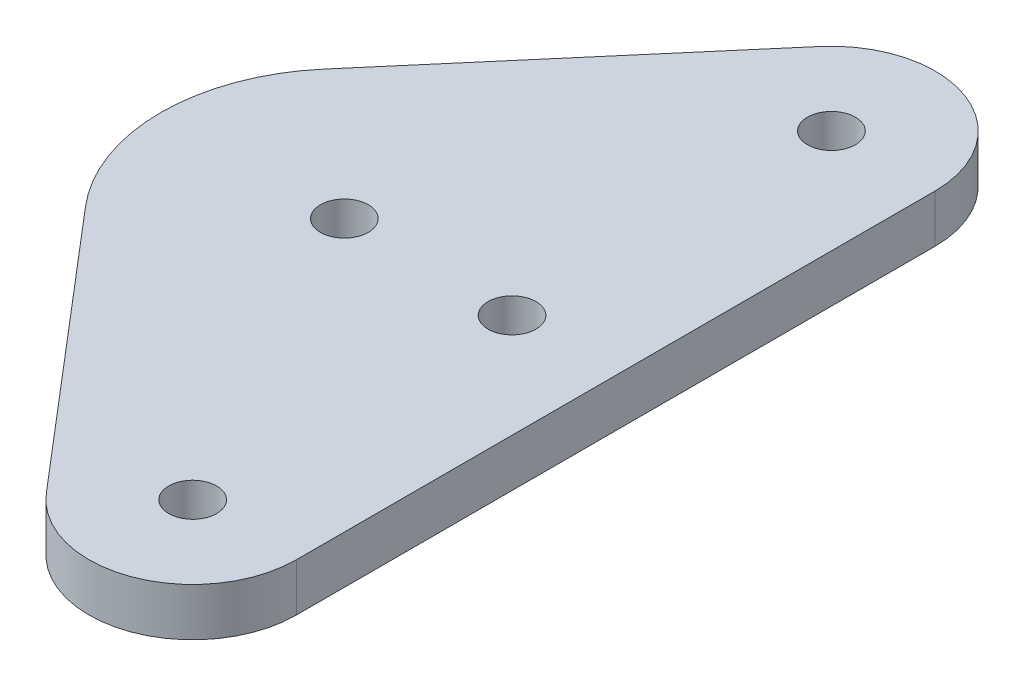
ISO-10303-21;
HEADER;
FILE_DESCRIPTION(('STEP AP214'),'2;1');
FILE_NAME('part.step','',(''),(''),'','','');
FILE_SCHEMA(('AUTOMOTIVE_DESIGN { 1 0 10303 214 1 1 1 1 }'));
ENDSEC;
DATA;
#1=APPLICATION_CONTEXT('core data for automotive mechanical design processes');
#2=APPLICATION_PROTOCOL_DEFINITION('international standard','automotive_design',2000,#1);
#3=PRODUCT_CONTEXT('',#1,'mechanical');
#4=PRODUCT('Part','Part','',(#3));
#5=PRODUCT_RELATED_PRODUCT_CATEGORY('part','',(#4));
#6=PRODUCT_DEFINITION_FORMATION('','',#4);
#7=PRODUCT_DEFINITION_CONTEXT('part definition',#1,'design');
#8=PRODUCT_DEFINITION('design','',#6,#7);
#9=PRODUCT_DEFINITION_SHAPE('','',#8);
#10=(LENGTH_UNIT() NAMED_UNIT(*) SI_UNIT(.MILLI.,.METRE.));
#11=(NAMED_UNIT(*) PLANE_ANGLE_UNIT() SI_UNIT($,.RADIAN.));
#12=(NAMED_UNIT(*) SI_UNIT($,.STERADIAN.) SOLID_ANGLE_UNIT());
#13=UNCERTAINTY_MEASURE_WITH_UNIT(LENGTH_MEASURE(1.E-05),#10,'distance_accuracy_value','');
#14=(GEOMETRIC_REPRESENTATION_CONTEXT(3) GLOBAL_UNCERTAINTY_ASSIGNED_CONTEXT((#13)) GLOBAL_UNIT_ASSIGNED_CONTEXT((#10,
#11,#12)) REPRESENTATION_CONTEXT('',''));
#15=CARTESIAN_POINT('',(0.,0.,0.));
#16=DIRECTION('',(0.,0.,1.));
#17=DIRECTION('',(1.,0.,0.));
#18=AXIS2_PLACEMENT_3D('',#15,#16,#17);
#19=CARTESIAN_POINT('',(0.,3.,-20.));
#20=DIRECTION('',(0.,1.,0.));
#21=DIRECTION('',(0.,0.,1.));
#22=AXIS2_PLACEMENT_3D('',#19,#20,#21);
#23=PLANE('',#22);
#24=CARTESIAN_POINT('',(0.,3.,20.));
#25=DIRECTION('',(0.,1.,0.));
#26=DIRECTION('',(0.,0.,1.));
#27=AXIS2_PLACEMENT_3D('',#24,#25,#26);
#28=CIRCLE('',#27,1.5);
#29=CARTESIAN_POINT('',(0.,3.,21.5));
#30=VERTEX_POINT('',#29);
#31=EDGE_CURVE('E156',#30,#30,#28,.T.);
#32=ORIENTED_EDGE('',*,*,#31,.F.);
#33=EDGE_LOOP('',(#32));
#34=FACE_BOUND('',#33,.T.);
#35=CARTESIAN_POINT('',(0.,3.,0.));
#36=DIRECTION('',(0.,1.,0.));
#37=DIRECTION('',(0.,0.,1.));
#38=AXIS2_PLACEMENT_3D('',#35,#36,#37);
#39=CIRCLE('',#38,1.5);
#40=CARTESIAN_POINT('',(0.,3.,1.5));
#41=VERTEX_POINT('',#40);
#42=EDGE_CURVE('E123',#41,#41,#39,.T.);
#43=ORIENTED_EDGE('',*,*,#42,.F.);
#44=EDGE_LOOP('',(#43));
#45=FACE_BOUND('',#44,.T.);
#46=CARTESIAN_POINT('',(0.,3.,-20.));
#47=DIRECTION('',(0.,1.,0.));
#48=DIRECTION('',(0.,0.,1.));
#49=AXIS2_PLACEMENT_3D('',#46,#47,#48);
#50=CIRCLE('',#49,6.5);
#51=CARTESIAN_POINT('',(6.5,3.,-20.));
#52=VERTEX_POINT('',#51);
#53=CARTESIAN_POINT('',(-4.94353905016833,3.,-24.2203580013384));
#54=VERTEX_POINT('',#53);
#55=EDGE_CURVE('E131',#52,#54,#50,.T.);
#56=ORIENTED_EDGE('',*,*,#55,.T.);
#57=DIRECTION('',(-0.649285846359749,0.,0.760544469256666));
#58=VECTOR('',#57,1.);
#59=CARTESIAN_POINT('',(-4.94353905016833,3.,-24.2203580013384));
#60=LINE('',#59,#58);
#61=CARTESIAN_POINT('',(-19.2462613964517,3.,-7.46678723313712));
#62=VERTEX_POINT('',#61);
#63=EDGE_CURVE('E85',#54,#62,#60,.T.);
#64=ORIENTED_EDGE('',*,*,#63,.T.);
#65=CARTESIAN_POINT('',(-10.5,3.,0.));
#66=DIRECTION('',(0.,1.,0.));
#67=DIRECTION('',(0.,0.,1.));
#68=AXIS2_PLACEMENT_3D('',#65,#66,#67);
#69=CIRCLE('',#68,11.5);
#70=CARTESIAN_POINT('',(-19.2462613964517,3.,7.46678723313712));
#71=VERTEX_POINT('',#70);
#72=EDGE_CURVE('E99',#62,#71,#69,.T.);
#73=ORIENTED_EDGE('',*,*,#72,.T.);
#74=DIRECTION('',(0.649285846359749,0.,0.760544469256666));
#75=VECTOR('',#74,1.);
#76=CARTESIAN_POINT('',(-19.2462613964517,3.,7.46678723313712));
#77=LINE('',#76,#75);
#78=CARTESIAN_POINT('',(-4.94353905016834,3.,24.2203580013384));
#79=VERTEX_POINT('',#78);
#80=EDGE_CURVE('E92',#71,#79,#77,.T.);
#81=ORIENTED_EDGE('',*,*,#80,.T.);
#82=CARTESIAN_POINT('',(0.,3.,20.));
#83=DIRECTION('',(0.,1.,0.));
#84=DIRECTION('',(0.,0.,1.));
#85=AXIS2_PLACEMENT_3D('',#82,#83,#84);
#86=CIRCLE('',#85,6.50000000000001);
#87=CARTESIAN_POINT('',(6.5,3.,20.));
#88=VERTEX_POINT('',#87);
#89=EDGE_CURVE('E96',#79,#88,#86,.T.);
#90=ORIENTED_EDGE('',*,*,#89,.T.);
#91=DIRECTION('',(0.,0.,-1.));
#92=VECTOR('',#91,1.);
#93=CARTESIAN_POINT('',(6.5,3.,0.));
#94=LINE('',#93,#92);
#95=EDGE_CURVE('E50',#88,#52,#94,.T.);
#96=ORIENTED_EDGE('',*,*,#95,.T.);
#97=EDGE_LOOP('',(#56,#64,#73,#81,#90,#96));
#98=FACE_BOUND('',#97,.T.);
#99=CARTESIAN_POINT('',(0.,3.,-20.));
#100=DIRECTION('',(0.,1.,0.));
#101=DIRECTION('',(0.,0.,1.));
#102=AXIS2_PLACEMENT_3D('',#99,#100,#101);
#103=CIRCLE('',#102,1.5);
#104=CARTESIAN_POINT('',(0.,3.,-18.5));
#105=VERTEX_POINT('',#104);
#106=EDGE_CURVE('E150',#105,#105,#103,.T.);
#107=ORIENTED_EDGE('',*,*,#106,.F.);
#108=EDGE_LOOP('',(#107));
#109=FACE_BOUND('',#108,.T.);
#110=CARTESIAN_POINT('',(-10.5,3.,0.));
#111=DIRECTION('',(0.,1.,0.));
#112=DIRECTION('',(0.,0.,1.));
#113=AXIS2_PLACEMENT_3D('',#110,#111,#112);
#114=CIRCLE('',#113,1.5);
#115=CARTESIAN_POINT('',(-10.5,3.,1.5));
#116=VERTEX_POINT('',#115);
#117=EDGE_CURVE('E162',#116,#116,#114,.T.);
#118=ORIENTED_EDGE('',*,*,#117,.F.);
#119=EDGE_LOOP('',(#118));
#120=FACE_BOUND('',#119,.T.);
#121=ADVANCED_FACE('F33',(#34,#45,#98,#109,#120),#23,.T.);
#122=CARTESIAN_POINT('',(0.,0.,-20.));
#123=DIRECTION('',(0.,1.,0.));
#124=DIRECTION('',(0.,0.,1.));
#125=AXIS2_PLACEMENT_3D('',#122,#123,#124);
#126=PLANE('',#125);
#127=CARTESIAN_POINT('',(0.,0.,-20.));
#128=DIRECTION('',(0.,1.,0.));
#129=DIRECTION('',(0.,0.,1.));
#130=AXIS2_PLACEMENT_3D('',#127,#128,#129);
#131=CIRCLE('',#130,6.5);
#132=CARTESIAN_POINT('',(6.5,0.,-20.));
#133=VERTEX_POINT('',#132);
#134=CARTESIAN_POINT('',(-4.94353905016833,0.,-24.2203580013384));
#135=VERTEX_POINT('',#134);
#136=EDGE_CURVE('E119',#133,#135,#131,.T.);
#137=ORIENTED_EDGE('',*,*,#136,.F.);
#138=DIRECTION('',(0.,0.,-1.));
#139=VECTOR('',#138,1.);
#140=CARTESIAN_POINT('',(6.5,0.,-20.));
#141=LINE('',#140,#139);
#142=CARTESIAN_POINT('',(6.5,0.,20.));
#143=VERTEX_POINT('',#142);
#144=EDGE_CURVE('E73',#143,#133,#141,.T.);
#145=ORIENTED_EDGE('',*,*,#144,.F.);
#146=CARTESIAN_POINT('',(0.,0.,20.));
#147=DIRECTION('',(0.,1.,0.));
#148=DIRECTION('',(0.,0.,1.));
#149=AXIS2_PLACEMENT_3D('',#146,#147,#148);
#150=CIRCLE('',#149,6.50000000000001);
#151=CARTESIAN_POINT('',(-4.94353905016834,0.,24.2203580013384));
#152=VERTEX_POINT('',#151);
#153=EDGE_CURVE('E128',#152,#143,#150,.T.);
#154=ORIENTED_EDGE('',*,*,#153,.F.);
#155=DIRECTION('',(0.649285846359749,0.,0.760544469256666));
#156=VECTOR('',#155,1.);
#157=CARTESIAN_POINT('',(-19.2462613964517,0.,7.46678723313712));
#158=LINE('',#157,#156);
#159=CARTESIAN_POINT('',(-19.2462613964517,0.,7.46678723313712));
#160=VERTEX_POINT('',#159);
#161=EDGE_CURVE('E108',#160,#152,#158,.T.);
#162=ORIENTED_EDGE('',*,*,#161,.F.);
#163=CARTESIAN_POINT('',(-10.5,0.,0.));
#164=DIRECTION('',(0.,1.,0.));
#165=DIRECTION('',(0.,0.,1.));
#166=AXIS2_PLACEMENT_3D('',#163,#164,#165);
#167=CIRCLE('',#166,11.5);
#168=CARTESIAN_POINT('',(-19.2462613964517,0.,-7.46678723313712));
#169=VERTEX_POINT('',#168);
#170=EDGE_CURVE('E125',#169,#160,#167,.T.);
#171=ORIENTED_EDGE('',*,*,#170,.F.);
#172=DIRECTION('',(-0.649285846359749,0.,0.760544469256666));
#173=VECTOR('',#172,1.);
#174=CARTESIAN_POINT('',(-4.94353905016833,0.,-24.2203580013384));
#175=LINE('',#174,#173);
#176=EDGE_CURVE('E122',#135,#169,#175,.T.);
#177=ORIENTED_EDGE('',*,*,#176,.F.);
#178=EDGE_LOOP('',(#137,#145,#154,#162,#171,#177));
#179=FACE_BOUND('',#178,.T.);
#180=CARTESIAN_POINT('',(0.,0.,0.));
#181=DIRECTION('',(0.,1.,0.));
#182=DIRECTION('',(0.,0.,1.));
#183=AXIS2_PLACEMENT_3D('',#180,#181,#182);
#184=CIRCLE('',#183,1.5);
#185=CARTESIAN_POINT('',(0.,0.,1.5));
#186=VERTEX_POINT('',#185);
#187=EDGE_CURVE('E147',#186,#186,#184,.T.);
#188=ORIENTED_EDGE('',*,*,#187,.T.);
#189=EDGE_LOOP('',(#188));
#190=FACE_BOUND('',#189,.T.);
#191=CARTESIAN_POINT('',(0.,0.,-20.));
#192=DIRECTION('',(0.,1.,0.));
#193=DIRECTION('',(0.,0.,1.));
#194=AXIS2_PLACEMENT_3D('',#191,#192,#193);
#195=CIRCLE('',#194,1.5);
#196=CARTESIAN_POINT('',(0.,0.,-18.5));
#197=VERTEX_POINT('',#196);
#198=EDGE_CURVE('E153',#197,#197,#195,.T.);
#199=ORIENTED_EDGE('',*,*,#198,.T.);
#200=EDGE_LOOP('',(#199));
#201=FACE_BOUND('',#200,.T.);
#202=CARTESIAN_POINT('',(0.,0.,20.));
#203=DIRECTION('',(0.,1.,0.));
#204=DIRECTION('',(0.,0.,1.));
#205=AXIS2_PLACEMENT_3D('',#202,#203,#204);
#206=CIRCLE('',#205,1.5);
#207=CARTESIAN_POINT('',(0.,0.,21.5));
#208=VERTEX_POINT('',#207);
#209=EDGE_CURVE('E159',#208,#208,#206,.T.);
#210=ORIENTED_EDGE('',*,*,#209,.T.);
#211=EDGE_LOOP('',(#210));
#212=FACE_BOUND('',#211,.T.);
#213=CARTESIAN_POINT('',(-10.5,0.,0.));
#214=DIRECTION('',(0.,1.,0.));
#215=DIRECTION('',(0.,0.,1.));
#216=AXIS2_PLACEMENT_3D('',#213,#214,#215);
#217=CIRCLE('',#216,1.5);
#218=CARTESIAN_POINT('',(-10.5,0.,1.5));
#219=VERTEX_POINT('',#218);
#220=EDGE_CURVE('E165',#219,#219,#217,.T.);
#221=ORIENTED_EDGE('',*,*,#220,.T.);
#222=EDGE_LOOP('',(#221));
#223=FACE_BOUND('',#222,.T.);
#224=ADVANCED_FACE('F138',(#179,#190,#201,#212,#223),#126,.F.);
#225=CARTESIAN_POINT('',(0.,3.,-20.));
#226=DIRECTION('',(0.,-1.,0.));
#227=DIRECTION('',(0.,0.,-1.));
#228=AXIS2_PLACEMENT_3D('',#225,#226,#227);
#229=CYLINDRICAL_SURFACE('',#228,6.5);
#230=ORIENTED_EDGE('',*,*,#136,.T.);
#231=DIRECTION('',(0.,-1.,0.));
#232=VECTOR('',#231,1.);
#233=CARTESIAN_POINT('',(-4.94353905016833,3.,-24.2203580013384));
#234=LINE('',#233,#232);
#235=EDGE_CURVE('E11',#54,#135,#234,.T.);
#236=ORIENTED_EDGE('',*,*,#235,.F.);
#237=ORIENTED_EDGE('',*,*,#55,.F.);
#238=DIRECTION('',(0.,-1.,0.));
#239=VECTOR('',#238,1.);
#240=CARTESIAN_POINT('',(6.5,3.,-20.));
#241=LINE('',#240,#239);
#242=EDGE_CURVE('E115',#52,#133,#241,.T.);
#243=ORIENTED_EDGE('',*,*,#242,.T.);
#244=EDGE_LOOP('',(#230,#236,#237,#243));
#245=FACE_BOUND('',#244,.T.);
#246=ADVANCED_FACE('F35',(#245),#229,.T.);
#247=CARTESIAN_POINT('',(-4.94353905016833,3.,-24.2203580013384));
#248=DIRECTION('',(0.760544469256666,0.,0.64928584635975));
#249=DIRECTION('',(0.64928584635975,0.,-0.760544469256666));
#250=AXIS2_PLACEMENT_3D('',#247,#248,#249);
#251=PLANE('',#250);
#252=ORIENTED_EDGE('',*,*,#176,.T.);
#253=DIRECTION('',(0.,-1.,0.));
#254=VECTOR('',#253,1.);
#255=CARTESIAN_POINT('',(-19.2462613964517,3.,-7.46678723313712));
#256=LINE('',#255,#254);
#257=EDGE_CURVE('E42',#62,#169,#256,.T.);
#258=ORIENTED_EDGE('',*,*,#257,.F.);
#259=ORIENTED_EDGE('',*,*,#63,.F.);
#260=ORIENTED_EDGE('',*,*,#235,.T.);
#261=EDGE_LOOP('',(#252,#258,#259,#260));
#262=FACE_BOUND('',#261,.T.);
#263=ADVANCED_FACE('F194',(#262),#251,.F.);
#264=CARTESIAN_POINT('',(-10.5,3.,0.));
#265=DIRECTION('',(0.,-1.,0.));
#266=DIRECTION('',(0.,0.,-1.));
#267=AXIS2_PLACEMENT_3D('',#264,#265,#266);
#268=CYLINDRICAL_SURFACE('',#267,11.5);
#269=ORIENTED_EDGE('',*,*,#170,.T.);
#270=DIRECTION('',(0.,-1.,0.));
#271=VECTOR('',#270,1.);
#272=CARTESIAN_POINT('',(-19.2462613964517,3.,7.46678723313712));
#273=LINE('',#272,#271);
#274=EDGE_CURVE('E110',#71,#160,#273,.T.);
#275=ORIENTED_EDGE('',*,*,#274,.F.);
#276=ORIENTED_EDGE('',*,*,#72,.F.);
#277=ORIENTED_EDGE('',*,*,#257,.T.);
#278=EDGE_LOOP('',(#269,#275,#276,#277));
#279=FACE_BOUND('',#278,.T.);
#280=ADVANCED_FACE('F137',(#279),#268,.T.);
#281=CARTESIAN_POINT('',(-19.2462613964517,3.,7.46678723313712));
#282=DIRECTION('',(0.760544469256666,0.,-0.649285846359749));
#283=DIRECTION('',(-0.649285846359749,0.,-0.760544469256666));
#284=AXIS2_PLACEMENT_3D('',#281,#282,#283);
#285=PLANE('',#284);
#286=ORIENTED_EDGE('',*,*,#161,.T.);
#287=DIRECTION('',(0.,-1.,0.));
#288=VECTOR('',#287,1.);
#289=CARTESIAN_POINT('',(-4.94353905016834,3.,24.2203580013384));
#290=LINE('',#289,#288);
#291=EDGE_CURVE('E105',#79,#152,#290,.T.);
#292=ORIENTED_EDGE('',*,*,#291,.F.);
#293=ORIENTED_EDGE('',*,*,#80,.F.);
#294=ORIENTED_EDGE('',*,*,#274,.T.);
#295=EDGE_LOOP('',(#286,#292,#293,#294));
#296=FACE_BOUND('',#295,.T.);
#297=ADVANCED_FACE('F106',(#296),#285,.F.);
#298=CARTESIAN_POINT('',(0.,3.,20.));
#299=DIRECTION('',(0.,-1.,0.));
#300=DIRECTION('',(0.,0.,-1.));
#301=AXIS2_PLACEMENT_3D('',#298,#299,#300);
#302=CYLINDRICAL_SURFACE('',#301,6.50000000000001);
#303=ORIENTED_EDGE('',*,*,#153,.T.);
#304=DIRECTION('',(0.,-1.,0.));
#305=VECTOR('',#304,1.);
#306=CARTESIAN_POINT('',(6.5,3.,20.));
#307=LINE('',#306,#305);
#308=EDGE_CURVE('E111',#88,#143,#307,.T.);
#309=ORIENTED_EDGE('',*,*,#308,.F.);
#310=ORIENTED_EDGE('',*,*,#89,.F.);
#311=ORIENTED_EDGE('',*,*,#291,.T.);
#312=EDGE_LOOP('',(#303,#309,#310,#311));
#313=FACE_BOUND('',#312,.T.);
#314=ADVANCED_FACE('F113',(#313),#302,.T.);
#315=CARTESIAN_POINT('',(6.5,3.,-20.));
#316=DIRECTION('',(-1.,0.,0.));
#317=DIRECTION('',(0.,0.,1.));
#318=AXIS2_PLACEMENT_3D('',#315,#316,#317);
#319=PLANE('',#318);
#320=ORIENTED_EDGE('',*,*,#144,.T.);
#321=ORIENTED_EDGE('',*,*,#242,.F.);
#322=ORIENTED_EDGE('',*,*,#95,.F.);
#323=ORIENTED_EDGE('',*,*,#308,.T.);
#324=EDGE_LOOP('',(#320,#321,#322,#323));
#325=FACE_BOUND('',#324,.T.);
#326=ADVANCED_FACE('F140',(#325),#319,.F.);
#327=CARTESIAN_POINT('',(0.,3.,0.));
#328=DIRECTION('',(0.,-1.,0.));
#329=DIRECTION('',(0.,0.,-1.));
#330=AXIS2_PLACEMENT_3D('',#327,#328,#329);
#331=CYLINDRICAL_SURFACE('',#330,1.5);
#332=ORIENTED_EDGE('',*,*,#42,.T.);
#333=EDGE_LOOP('',(#332));
#334=FACE_BOUND('',#333,.T.);
#335=ORIENTED_EDGE('',*,*,#187,.F.);
#336=EDGE_LOOP('',(#335));
#337=FACE_BOUND('',#336,.T.);
#338=ADVANCED_FACE('F184',(#334,#337),#331,.F.);
#339=CARTESIAN_POINT('',(0.,3.,-20.));
#340=DIRECTION('',(0.,-1.,0.));
#341=DIRECTION('',(0.,0.,-1.));
#342=AXIS2_PLACEMENT_3D('',#339,#340,#341);
#343=CYLINDRICAL_SURFACE('',#342,1.5);
#344=ORIENTED_EDGE('',*,*,#106,.T.);
#345=EDGE_LOOP('',(#344));
#346=FACE_BOUND('',#345,.T.);
#347=ORIENTED_EDGE('',*,*,#198,.F.);
#348=EDGE_LOOP('',(#347));
#349=FACE_BOUND('',#348,.T.);
#350=ADVANCED_FACE('F248',(#346,#349),#343,.F.);
#351=CARTESIAN_POINT('',(0.,3.,20.));
#352=DIRECTION('',(0.,-1.,0.));
#353=DIRECTION('',(0.,0.,-1.));
#354=AXIS2_PLACEMENT_3D('',#351,#352,#353);
#355=CYLINDRICAL_SURFACE('',#354,1.5);
#356=ORIENTED_EDGE('',*,*,#31,.T.);
#357=EDGE_LOOP('',(#356));
#358=FACE_BOUND('',#357,.T.);
#359=ORIENTED_EDGE('',*,*,#209,.F.);
#360=EDGE_LOOP('',(#359));
#361=FACE_BOUND('',#360,.T.);
#362=ADVANCED_FACE('F256',(#358,#361),#355,.F.);
#363=CARTESIAN_POINT('',(-10.5,3.,0.));
#364=DIRECTION('',(0.,-1.,0.));
#365=DIRECTION('',(0.,0.,-1.));
#366=AXIS2_PLACEMENT_3D('',#363,#364,#365);
#367=CYLINDRICAL_SURFACE('',#366,1.5);
#368=ORIENTED_EDGE('',*,*,#117,.T.);
#369=EDGE_LOOP('',(#368));
#370=FACE_BOUND('',#369,.T.);
#371=ORIENTED_EDGE('',*,*,#220,.F.);
#372=EDGE_LOOP('',(#371));
#373=FACE_BOUND('',#372,.T.);
#374=ADVANCED_FACE('F171',(#370,#373),#367,.F.);
#375=CLOSED_SHELL('',(#121,#224,#246,#263,#280,#297,#314,#326,#338,#350,#362,#374));
#376=MANIFOLD_SOLID_BREP('B2',#375);
#377=ADVANCED_BREP_SHAPE_REPRESENTATION('',(#18,#376),#14);
#378=SHAPE_DEFINITION_REPRESENTATION(#9,#377);
ENDSEC;
END-ISO-10303-21;
